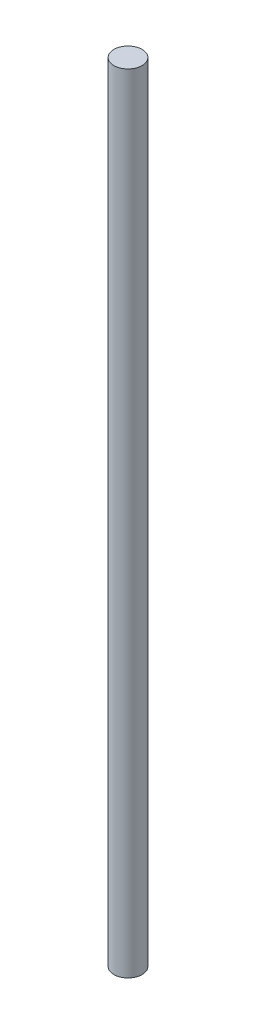
ISO-10303-21;
HEADER;
FILE_DESCRIPTION(('STEP AP214'),'2;1');
FILE_NAME('part.step','',(''),(''),'','','');
FILE_SCHEMA(('AUTOMOTIVE_DESIGN { 1 0 10303 214 1 1 1 1 }'));
ENDSEC;
DATA;
#1=APPLICATION_CONTEXT('core data for automotive mechanical design processes');
#2=APPLICATION_PROTOCOL_DEFINITION('international standard','automotive_design',2000,#1);
#3=PRODUCT_CONTEXT('',#1,'mechanical');
#4=PRODUCT('Part','Part','',(#3));
#5=PRODUCT_RELATED_PRODUCT_CATEGORY('part','',(#4));
#6=PRODUCT_DEFINITION_FORMATION('','',#4);
#7=PRODUCT_DEFINITION_CONTEXT('part definition',#1,'design');
#8=PRODUCT_DEFINITION('design','',#6,#7);
#9=PRODUCT_DEFINITION_SHAPE('','',#8);
#10=(LENGTH_UNIT() NAMED_UNIT(*) SI_UNIT(.MILLI.,.METRE.));
#11=(NAMED_UNIT(*) PLANE_ANGLE_UNIT() SI_UNIT($,.RADIAN.));
#12=(NAMED_UNIT(*) SI_UNIT($,.STERADIAN.) SOLID_ANGLE_UNIT());
#13=UNCERTAINTY_MEASURE_WITH_UNIT(LENGTH_MEASURE(1.E-05),#10,'distance_accuracy_value','');
#14=(GEOMETRIC_REPRESENTATION_CONTEXT(3) GLOBAL_UNCERTAINTY_ASSIGNED_CONTEXT((#13)) GLOBAL_UNIT_ASSIGNED_CONTEXT((#10,
#11,#12)) REPRESENTATION_CONTEXT('',''));
#15=CARTESIAN_POINT('',(0.,0.,0.));
#16=DIRECTION('',(0.,0.,1.));
#17=DIRECTION('',(1.,0.,0.));
#18=AXIS2_PLACEMENT_3D('',#15,#16,#17);
#19=CARTESIAN_POINT('',(0.,140.,0.));
#20=DIRECTION('',(0.,-1.,0.));
#21=DIRECTION('',(0.,0.,-1.));
#22=AXIS2_PLACEMENT_3D('',#19,#20,#21);
#23=CYLINDRICAL_SURFACE('',#22,2.5);
#24=CARTESIAN_POINT('',(0.,140.,0.));
#25=DIRECTION('',(0.,1.,0.));
#26=DIRECTION('',(0.,0.,1.));
#27=AXIS2_PLACEMENT_3D('',#24,#25,#26);
#28=CIRCLE('',#27,2.5);
#29=CARTESIAN_POINT('',(0.,140.,2.5));
#30=VERTEX_POINT('',#29);
#31=EDGE_CURVE('E10',#30,#30,#28,.T.);
#32=ORIENTED_EDGE('',*,*,#31,.F.);
#33=EDGE_LOOP('',(#32));
#34=FACE_BOUND('',#33,.T.);
#35=CARTESIAN_POINT('',(0.,0.,0.));
#36=DIRECTION('',(0.,1.,0.));
#37=DIRECTION('',(0.,0.,1.));
#38=AXIS2_PLACEMENT_3D('',#35,#36,#37);
#39=CIRCLE('',#38,2.5);
#40=CARTESIAN_POINT('',(0.,0.,2.5));
#41=VERTEX_POINT('',#40);
#42=EDGE_CURVE('E34',#41,#41,#39,.T.);
#43=ORIENTED_EDGE('',*,*,#42,.T.);
#44=EDGE_LOOP('',(#43));
#45=FACE_BOUND('',#44,.T.);
#46=ADVANCED_FACE('F31',(#34,#45),#23,.T.);
#47=CARTESIAN_POINT('',(0.,140.,0.));
#48=DIRECTION('',(0.,1.,0.));
#49=DIRECTION('',(0.,0.,1.));
#50=AXIS2_PLACEMENT_3D('',#47,#48,#49);
#51=PLANE('',#50);
#52=ORIENTED_EDGE('',*,*,#31,.T.);
#53=EDGE_LOOP('',(#52));
#54=FACE_BOUND('',#53,.T.);
#55=ADVANCED_FACE('F46',(#54),#51,.T.);
#56=CARTESIAN_POINT('',(0.,0.,0.));
#57=DIRECTION('',(0.,1.,0.));
#58=DIRECTION('',(0.,0.,1.));
#59=AXIS2_PLACEMENT_3D('',#56,#57,#58);
#60=PLANE('',#59);
#61=ORIENTED_EDGE('',*,*,#42,.F.);
#62=EDGE_LOOP('',(#61));
#63=FACE_BOUND('',#62,.T.);
#64=ADVANCED_FACE('F44',(#63),#60,.F.);
#65=CLOSED_SHELL('',(#46,#55,#64));
#66=MANIFOLD_SOLID_BREP('B2',#65);
#67=ADVANCED_BREP_SHAPE_REPRESENTATION('',(#18,#66),#14);
#68=SHAPE_DEFINITION_REPRESENTATION(#9,#67);
ENDSEC;
END-ISO-10303-21;
